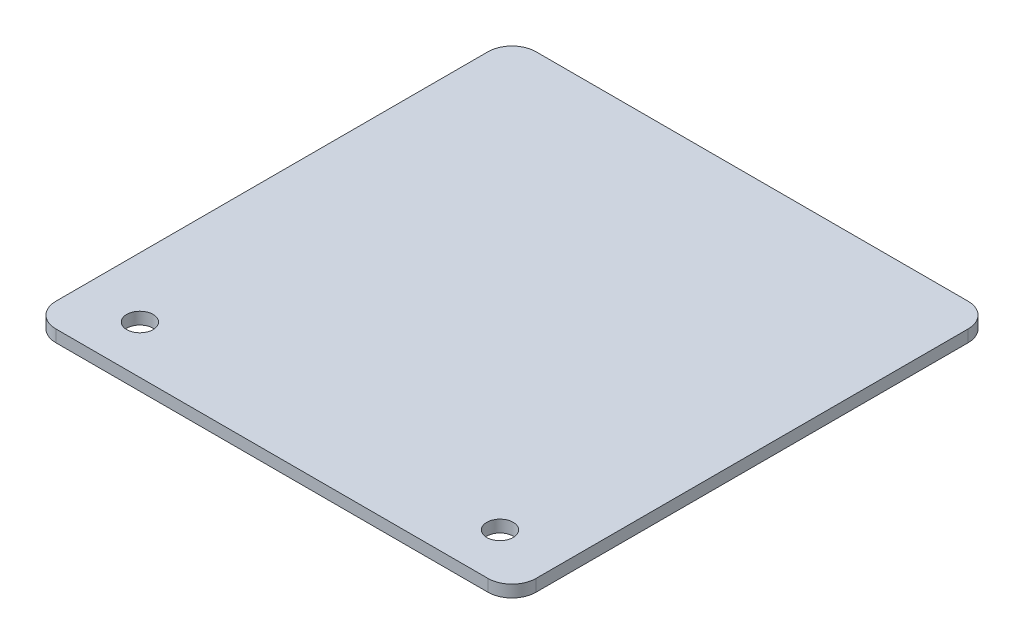
ISO-10303-21;
HEADER;
FILE_DESCRIPTION(('STEP AP214'),'2;1');
FILE_NAME('part.step','',(''),(''),'','','');
FILE_SCHEMA(('AUTOMOTIVE_DESIGN { 1 0 10303 214 1 1 1 1 }'));
ENDSEC;
DATA;
#1=APPLICATION_CONTEXT('core data for automotive mechanical design processes');
#2=APPLICATION_PROTOCOL_DEFINITION('international standard','automotive_design',2000,#1);
#3=PRODUCT_CONTEXT('',#1,'mechanical');
#4=PRODUCT('Part','Part','',(#3));
#5=PRODUCT_RELATED_PRODUCT_CATEGORY('part','',(#4));
#6=PRODUCT_DEFINITION_FORMATION('','',#4);
#7=PRODUCT_DEFINITION_CONTEXT('part definition',#1,'design');
#8=PRODUCT_DEFINITION('design','',#6,#7);
#9=PRODUCT_DEFINITION_SHAPE('','',#8);
#10=(LENGTH_UNIT() NAMED_UNIT(*) SI_UNIT(.MILLI.,.METRE.));
#11=(NAMED_UNIT(*) PLANE_ANGLE_UNIT() SI_UNIT($,.RADIAN.));
#12=(NAMED_UNIT(*) SI_UNIT($,.STERADIAN.) SOLID_ANGLE_UNIT());
#13=UNCERTAINTY_MEASURE_WITH_UNIT(LENGTH_MEASURE(1.E-05),#10,'distance_accuracy_value','');
#14=(GEOMETRIC_REPRESENTATION_CONTEXT(3) GLOBAL_UNCERTAINTY_ASSIGNED_CONTEXT((#13)) GLOBAL_UNIT_ASSIGNED_CONTEXT((#10,
#11,#12)) REPRESENTATION_CONTEXT('',''));
#15=CARTESIAN_POINT('',(0.,0.,0.));
#16=DIRECTION('',(0.,0.,1.));
#17=DIRECTION('',(1.,0.,0.));
#18=AXIS2_PLACEMENT_3D('',#15,#16,#17);
#19=CARTESIAN_POINT('',(50.,2.5,50.));
#20=DIRECTION('',(-1.,0.,0.));
#21=DIRECTION('',(0.,0.,1.));
#22=AXIS2_PLACEMENT_3D('',#19,#20,#21);
#23=PLANE('',#22);
#24=DIRECTION('',(0.,0.,-1.));
#25=VECTOR('',#24,1.);
#26=CARTESIAN_POINT('',(50.,0.,50.));
#27=LINE('',#26,#25);
#28=CARTESIAN_POINT('',(50.,0.,45.));
#29=VERTEX_POINT('',#28);
#30=CARTESIAN_POINT('',(50.,0.,-45.));
#31=VERTEX_POINT('',#30);
#32=EDGE_CURVE('E129',#29,#31,#27,.T.);
#33=ORIENTED_EDGE('',*,*,#32,.T.);
#34=DIRECTION('',(0.,-1.,0.));
#35=VECTOR('',#34,1.);
#36=CARTESIAN_POINT('',(50.,2.5,-45.));
#37=LINE('',#36,#35);
#38=CARTESIAN_POINT('',(50.,2.5,-45.));
#39=VERTEX_POINT('',#38);
#40=EDGE_CURVE('E159',#31,#39,#37,.F.);
#41=ORIENTED_EDGE('',*,*,#40,.T.);
#42=DIRECTION('',(0.,0.,-1.));
#43=VECTOR('',#42,1.);
#44=CARTESIAN_POINT('',(50.,2.5,50.));
#45=LINE('',#44,#43);
#46=CARTESIAN_POINT('',(50.,2.5,45.));
#47=VERTEX_POINT('',#46);
#48=EDGE_CURVE('E127',#47,#39,#45,.T.);
#49=ORIENTED_EDGE('',*,*,#48,.F.);
#50=DIRECTION('',(0.,-1.,0.));
#51=VECTOR('',#50,1.);
#52=CARTESIAN_POINT('',(50.,2.5,45.));
#53=LINE('',#52,#51);
#54=EDGE_CURVE('E156',#47,#29,#53,.T.);
#55=ORIENTED_EDGE('',*,*,#54,.T.);
#56=EDGE_LOOP('',(#33,#41,#49,#55));
#57=FACE_BOUND('',#56,.T.);
#58=ADVANCED_FACE('F32',(#57),#23,.F.);
#59=CARTESIAN_POINT('',(-50.,2.5,-50.));
#60=DIRECTION('',(0.,0.,1.));
#61=DIRECTION('',(1.,0.,0.));
#62=AXIS2_PLACEMENT_3D('',#59,#60,#61);
#63=PLANE('',#62);
#64=DIRECTION('',(-1.,0.,0.));
#65=VECTOR('',#64,1.);
#66=CARTESIAN_POINT('',(-50.,0.,-50.));
#67=LINE('',#66,#65);
#68=CARTESIAN_POINT('',(45.,0.,-50.));
#69=VERTEX_POINT('',#68);
#70=CARTESIAN_POINT('',(-45.,0.,-50.));
#71=VERTEX_POINT('',#70);
#72=EDGE_CURVE('E125',#69,#71,#67,.T.);
#73=ORIENTED_EDGE('',*,*,#72,.T.);
#74=DIRECTION('',(0.,-1.,0.));
#75=VECTOR('',#74,1.);
#76=CARTESIAN_POINT('',(-45.,2.5,-50.));
#77=LINE('',#76,#75);
#78=CARTESIAN_POINT('',(-45.,2.5,-50.));
#79=VERTEX_POINT('',#78);
#80=EDGE_CURVE('E103',#71,#79,#77,.F.);
#81=ORIENTED_EDGE('',*,*,#80,.T.);
#82=DIRECTION('',(-1.,0.,0.));
#83=VECTOR('',#82,1.);
#84=CARTESIAN_POINT('',(-50.,2.5,-50.));
#85=LINE('',#84,#83);
#86=CARTESIAN_POINT('',(45.,2.5,-50.));
#87=VERTEX_POINT('',#86);
#88=EDGE_CURVE('E173',#87,#79,#85,.T.);
#89=ORIENTED_EDGE('',*,*,#88,.F.);
#90=DIRECTION('',(0.,-1.,0.));
#91=VECTOR('',#90,1.);
#92=CARTESIAN_POINT('',(45.,2.5,-50.));
#93=LINE('',#92,#91);
#94=EDGE_CURVE('E108',#87,#69,#93,.T.);
#95=ORIENTED_EDGE('',*,*,#94,.T.);
#96=EDGE_LOOP('',(#73,#81,#89,#95));
#97=FACE_BOUND('',#96,.T.);
#98=ADVANCED_FACE('F178',(#97),#63,.F.);
#99=CARTESIAN_POINT('',(-50.,2.5,50.));
#100=DIRECTION('',(1.,0.,0.));
#101=DIRECTION('',(0.,0.,-1.));
#102=AXIS2_PLACEMENT_3D('',#99,#100,#101);
#103=PLANE('',#102);
#104=DIRECTION('',(0.,0.,1.));
#105=VECTOR('',#104,1.);
#106=CARTESIAN_POINT('',(-50.,2.5,50.));
#107=LINE('',#106,#105);
#108=CARTESIAN_POINT('',(-50.,2.5,-45.));
#109=VERTEX_POINT('',#108);
#110=CARTESIAN_POINT('',(-50.,2.5,45.));
#111=VERTEX_POINT('',#110);
#112=EDGE_CURVE('E117',#109,#111,#107,.T.);
#113=ORIENTED_EDGE('',*,*,#112,.F.);
#114=DIRECTION('',(0.,-1.,0.));
#115=VECTOR('',#114,1.);
#116=CARTESIAN_POINT('',(-50.,2.5,-45.));
#117=LINE('',#116,#115);
#118=CARTESIAN_POINT('',(-50.,0.,-45.));
#119=VERTEX_POINT('',#118);
#120=EDGE_CURVE('E102',#109,#119,#117,.T.);
#121=ORIENTED_EDGE('',*,*,#120,.T.);
#122=DIRECTION('',(0.,0.,1.));
#123=VECTOR('',#122,1.);
#124=CARTESIAN_POINT('',(-50.,0.,50.));
#125=LINE('',#124,#123);
#126=CARTESIAN_POINT('',(-50.,0.,45.));
#127=VERTEX_POINT('',#126);
#128=EDGE_CURVE('E115',#119,#127,#125,.T.);
#129=ORIENTED_EDGE('',*,*,#128,.T.);
#130=DIRECTION('',(0.,-1.,0.));
#131=VECTOR('',#130,1.);
#132=CARTESIAN_POINT('',(-50.,2.5,45.));
#133=LINE('',#132,#131);
#134=EDGE_CURVE('E119',#127,#111,#133,.F.);
#135=ORIENTED_EDGE('',*,*,#134,.T.);
#136=EDGE_LOOP('',(#113,#121,#129,#135));
#137=FACE_BOUND('',#136,.T.);
#138=ADVANCED_FACE('F114',(#137),#103,.F.);
#139=CARTESIAN_POINT('',(-50.,2.5,50.));
#140=DIRECTION('',(0.,0.,-1.));
#141=DIRECTION('',(-1.,0.,0.));
#142=AXIS2_PLACEMENT_3D('',#139,#140,#141);
#143=PLANE('',#142);
#144=DIRECTION('',(1.,0.,0.));
#145=VECTOR('',#144,1.);
#146=CARTESIAN_POINT('',(-50.,2.5,50.));
#147=LINE('',#146,#145);
#148=CARTESIAN_POINT('',(-45.,2.5,50.));
#149=VERTEX_POINT('',#148);
#150=CARTESIAN_POINT('',(45.,2.5,50.));
#151=VERTEX_POINT('',#150);
#152=EDGE_CURVE('E141',#149,#151,#147,.T.);
#153=ORIENTED_EDGE('',*,*,#152,.F.);
#154=DIRECTION('',(0.,-1.,0.));
#155=VECTOR('',#154,1.);
#156=CARTESIAN_POINT('',(-45.,2.5,50.));
#157=LINE('',#156,#155);
#158=CARTESIAN_POINT('',(-45.,0.,50.));
#159=VERTEX_POINT('',#158);
#160=EDGE_CURVE('E11',#149,#159,#157,.T.);
#161=ORIENTED_EDGE('',*,*,#160,.T.);
#162=DIRECTION('',(1.,0.,0.));
#163=VECTOR('',#162,1.);
#164=CARTESIAN_POINT('',(-50.,0.,50.));
#165=LINE('',#164,#163);
#166=CARTESIAN_POINT('',(45.,0.,50.));
#167=VERTEX_POINT('',#166);
#168=EDGE_CURVE('E124',#159,#167,#165,.T.);
#169=ORIENTED_EDGE('',*,*,#168,.T.);
#170=DIRECTION('',(0.,-1.,0.));
#171=VECTOR('',#170,1.);
#172=CARTESIAN_POINT('',(45.,2.5,50.));
#173=LINE('',#172,#171);
#174=EDGE_CURVE('E40',#167,#151,#173,.F.);
#175=ORIENTED_EDGE('',*,*,#174,.T.);
#176=EDGE_LOOP('',(#153,#161,#169,#175));
#177=FACE_BOUND('',#176,.T.);
#178=ADVANCED_FACE('F192',(#177),#143,.F.);
#179=CARTESIAN_POINT('',(0.,2.5,0.));
#180=DIRECTION('',(0.,-1.,0.));
#181=DIRECTION('',(0.,0.,-1.));
#182=AXIS2_PLACEMENT_3D('',#179,#180,#181);
#183=PLANE('',#182);
#184=CARTESIAN_POINT('',(-37.5,2.5,40.));
#185=DIRECTION('',(0.,1.,0.));
#186=DIRECTION('',(0.,0.,1.));
#187=AXIS2_PLACEMENT_3D('',#184,#185,#186);
#188=CIRCLE('',#187,2.74999999999999);
#189=CARTESIAN_POINT('',(-37.5,2.5,42.75));
#190=VERTEX_POINT('',#189);
#191=EDGE_CURVE('E140',#190,#190,#188,.T.);
#192=ORIENTED_EDGE('',*,*,#191,.F.);
#193=EDGE_LOOP('',(#192));
#194=FACE_BOUND('',#193,.T.);
#195=CARTESIAN_POINT('',(37.5,2.5,40.));
#196=DIRECTION('',(0.,1.,0.));
#197=DIRECTION('',(0.,0.,1.));
#198=AXIS2_PLACEMENT_3D('',#195,#196,#197);
#199=CIRCLE('',#198,2.74999999999999);
#200=CARTESIAN_POINT('',(37.5,2.5,42.75));
#201=VERTEX_POINT('',#200);
#202=EDGE_CURVE('E136',#201,#201,#199,.T.);
#203=ORIENTED_EDGE('',*,*,#202,.F.);
#204=EDGE_LOOP('',(#203));
#205=FACE_BOUND('',#204,.T.);
#206=ORIENTED_EDGE('',*,*,#88,.T.);
#207=CARTESIAN_POINT('',(-45.,2.5,-45.));
#208=DIRECTION('',(0.,-1.,0.));
#209=DIRECTION('',(0.,0.,-1.));
#210=AXIS2_PLACEMENT_3D('',#207,#208,#209);
#211=CIRCLE('',#210,5.);
#212=EDGE_CURVE('E154',#79,#109,#211,.F.);
#213=ORIENTED_EDGE('',*,*,#212,.T.);
#214=ORIENTED_EDGE('',*,*,#112,.T.);
#215=CARTESIAN_POINT('',(-45.,2.5,45.));
#216=DIRECTION('',(0.,-1.,0.));
#217=DIRECTION('',(0.,0.,-1.));
#218=AXIS2_PLACEMENT_3D('',#215,#216,#217);
#219=CIRCLE('',#218,5.);
#220=EDGE_CURVE('E53',#111,#149,#219,.F.);
#221=ORIENTED_EDGE('',*,*,#220,.T.);
#222=ORIENTED_EDGE('',*,*,#152,.T.);
#223=CARTESIAN_POINT('',(45.,2.5,45.));
#224=DIRECTION('',(0.,-1.,0.));
#225=DIRECTION('',(0.,0.,-1.));
#226=AXIS2_PLACEMENT_3D('',#223,#224,#225);
#227=CIRCLE('',#226,5.);
#228=EDGE_CURVE('E149',#151,#47,#227,.F.);
#229=ORIENTED_EDGE('',*,*,#228,.T.);
#230=ORIENTED_EDGE('',*,*,#48,.T.);
#231=CARTESIAN_POINT('',(45.,2.5,-45.));
#232=DIRECTION('',(0.,-1.,0.));
#233=DIRECTION('',(0.,0.,-1.));
#234=AXIS2_PLACEMENT_3D('',#231,#232,#233);
#235=CIRCLE('',#234,5.);
#236=EDGE_CURVE('E152',#39,#87,#235,.F.);
#237=ORIENTED_EDGE('',*,*,#236,.T.);
#238=EDGE_LOOP('',(#206,#213,#214,#221,#222,#229,#230,#237));
#239=FACE_BOUND('',#238,.T.);
#240=ADVANCED_FACE('F170',(#194,#205,#239),#183,.F.);
#241=CARTESIAN_POINT('',(0.,0.,0.));
#242=DIRECTION('',(0.,-1.,0.));
#243=DIRECTION('',(0.,0.,-1.));
#244=AXIS2_PLACEMENT_3D('',#241,#242,#243);
#245=PLANE('',#244);
#246=CARTESIAN_POINT('',(-37.5,0.,40.));
#247=DIRECTION('',(0.,-1.,0.));
#248=DIRECTION('',(0.,0.,-1.));
#249=AXIS2_PLACEMENT_3D('',#246,#247,#248);
#250=CIRCLE('',#249,2.74999999999999);
#251=CARTESIAN_POINT('',(-37.5,0.,37.25));
#252=VERTEX_POINT('',#251);
#253=EDGE_CURVE('E137',#252,#252,#250,.T.);
#254=ORIENTED_EDGE('',*,*,#253,.F.);
#255=EDGE_LOOP('',(#254));
#256=FACE_BOUND('',#255,.T.);
#257=CARTESIAN_POINT('',(37.5,0.,40.));
#258=DIRECTION('',(0.,-1.,0.));
#259=DIRECTION('',(0.,0.,-1.));
#260=AXIS2_PLACEMENT_3D('',#257,#258,#259);
#261=CIRCLE('',#260,2.74999999999999);
#262=CARTESIAN_POINT('',(37.5,0.,37.25));
#263=VERTEX_POINT('',#262);
#264=EDGE_CURVE('E133',#263,#263,#261,.T.);
#265=ORIENTED_EDGE('',*,*,#264,.F.);
#266=EDGE_LOOP('',(#265));
#267=FACE_BOUND('',#266,.T.);
#268=ORIENTED_EDGE('',*,*,#128,.F.);
#269=CARTESIAN_POINT('',(-45.,0.,-45.));
#270=DIRECTION('',(0.,-1.,0.));
#271=DIRECTION('',(0.,0.,-1.));
#272=AXIS2_PLACEMENT_3D('',#269,#270,#271);
#273=CIRCLE('',#272,5.);
#274=EDGE_CURVE('E98',#119,#71,#273,.T.);
#275=ORIENTED_EDGE('',*,*,#274,.T.);
#276=ORIENTED_EDGE('',*,*,#72,.F.);
#277=CARTESIAN_POINT('',(45.,0.,-45.));
#278=DIRECTION('',(0.,-1.,0.));
#279=DIRECTION('',(0.,0.,-1.));
#280=AXIS2_PLACEMENT_3D('',#277,#278,#279);
#281=CIRCLE('',#280,5.);
#282=EDGE_CURVE('E109',#69,#31,#281,.T.);
#283=ORIENTED_EDGE('',*,*,#282,.T.);
#284=ORIENTED_EDGE('',*,*,#32,.F.);
#285=CARTESIAN_POINT('',(45.,0.,45.));
#286=DIRECTION('',(0.,-1.,0.));
#287=DIRECTION('',(0.,0.,-1.));
#288=AXIS2_PLACEMENT_3D('',#285,#286,#287);
#289=CIRCLE('',#288,5.);
#290=EDGE_CURVE('E118',#29,#167,#289,.T.);
#291=ORIENTED_EDGE('',*,*,#290,.T.);
#292=ORIENTED_EDGE('',*,*,#168,.F.);
#293=CARTESIAN_POINT('',(-45.,0.,45.));
#294=DIRECTION('',(0.,-1.,0.));
#295=DIRECTION('',(0.,0.,-1.));
#296=AXIS2_PLACEMENT_3D('',#293,#294,#295);
#297=CIRCLE('',#296,5.);
#298=EDGE_CURVE('E123',#159,#127,#297,.T.);
#299=ORIENTED_EDGE('',*,*,#298,.T.);
#300=EDGE_LOOP('',(#268,#275,#276,#283,#284,#291,#292,#299));
#301=FACE_BOUND('',#300,.T.);
#302=ADVANCED_FACE('F121',(#256,#267,#301),#245,.T.);
#303=CARTESIAN_POINT('',(37.5,2.5,40.));
#304=DIRECTION('',(0.,1.,0.));
#305=DIRECTION('',(0.,0.,1.));
#306=AXIS2_PLACEMENT_3D('',#303,#304,#305);
#307=CYLINDRICAL_SURFACE('',#306,2.74999999999999);
#308=ORIENTED_EDGE('',*,*,#264,.T.);
#309=EDGE_LOOP('',(#308));
#310=FACE_BOUND('',#309,.T.);
#311=ORIENTED_EDGE('',*,*,#202,.T.);
#312=EDGE_LOOP('',(#311));
#313=FACE_BOUND('',#312,.T.);
#314=ADVANCED_FACE('F196',(#310,#313),#307,.F.);
#315=CARTESIAN_POINT('',(-37.5,2.5,40.));
#316=DIRECTION('',(0.,1.,0.));
#317=DIRECTION('',(0.,0.,1.));
#318=AXIS2_PLACEMENT_3D('',#315,#316,#317);
#319=CYLINDRICAL_SURFACE('',#318,2.74999999999999);
#320=ORIENTED_EDGE('',*,*,#253,.T.);
#321=EDGE_LOOP('',(#320));
#322=FACE_BOUND('',#321,.T.);
#323=ORIENTED_EDGE('',*,*,#191,.T.);
#324=EDGE_LOOP('',(#323));
#325=FACE_BOUND('',#324,.T.);
#326=ADVANCED_FACE('F188',(#322,#325),#319,.F.);
#327=CARTESIAN_POINT('',(-45.,2.5,-45.));
#328=DIRECTION('',(0.,-1.,0.));
#329=DIRECTION('',(0.,0.,-1.));
#330=AXIS2_PLACEMENT_3D('',#327,#328,#329);
#331=CYLINDRICAL_SURFACE('',#330,5.);
#332=ORIENTED_EDGE('',*,*,#212,.F.);
#333=ORIENTED_EDGE('',*,*,#80,.F.);
#334=ORIENTED_EDGE('',*,*,#274,.F.);
#335=ORIENTED_EDGE('',*,*,#120,.F.);
#336=EDGE_LOOP('',(#332,#333,#334,#335));
#337=FACE_BOUND('',#336,.T.);
#338=ADVANCED_FACE('F101',(#337),#331,.T.);
#339=CARTESIAN_POINT('',(45.,2.5,-45.));
#340=DIRECTION('',(0.,-1.,0.));
#341=DIRECTION('',(0.,0.,-1.));
#342=AXIS2_PLACEMENT_3D('',#339,#340,#341);
#343=CYLINDRICAL_SURFACE('',#342,5.);
#344=ORIENTED_EDGE('',*,*,#236,.F.);
#345=ORIENTED_EDGE('',*,*,#40,.F.);
#346=ORIENTED_EDGE('',*,*,#282,.F.);
#347=ORIENTED_EDGE('',*,*,#94,.F.);
#348=EDGE_LOOP('',(#344,#345,#346,#347));
#349=FACE_BOUND('',#348,.T.);
#350=ADVANCED_FACE('F176',(#349),#343,.T.);
#351=CARTESIAN_POINT('',(-45.,2.5,45.));
#352=DIRECTION('',(0.,-1.,0.));
#353=DIRECTION('',(0.,0.,-1.));
#354=AXIS2_PLACEMENT_3D('',#351,#352,#353);
#355=CYLINDRICAL_SURFACE('',#354,5.);
#356=ORIENTED_EDGE('',*,*,#220,.F.);
#357=ORIENTED_EDGE('',*,*,#134,.F.);
#358=ORIENTED_EDGE('',*,*,#298,.F.);
#359=ORIENTED_EDGE('',*,*,#160,.F.);
#360=EDGE_LOOP('',(#356,#357,#358,#359));
#361=FACE_BOUND('',#360,.T.);
#362=ADVANCED_FACE('F219',(#361),#355,.T.);
#363=CARTESIAN_POINT('',(45.,2.5,45.));
#364=DIRECTION('',(0.,-1.,0.));
#365=DIRECTION('',(0.,0.,-1.));
#366=AXIS2_PLACEMENT_3D('',#363,#364,#365);
#367=CYLINDRICAL_SURFACE('',#366,5.);
#368=ORIENTED_EDGE('',*,*,#228,.F.);
#369=ORIENTED_EDGE('',*,*,#174,.F.);
#370=ORIENTED_EDGE('',*,*,#290,.F.);
#371=ORIENTED_EDGE('',*,*,#54,.F.);
#372=EDGE_LOOP('',(#368,#369,#370,#371));
#373=FACE_BOUND('',#372,.T.);
#374=ADVANCED_FACE('F34',(#373),#367,.T.);
#375=CLOSED_SHELL('',(#58,#98,#138,#178,#240,#302,#314,#326,#338,#350,#362,#374));
#376=MANIFOLD_SOLID_BREP('B2',#375);
#377=ADVANCED_BREP_SHAPE_REPRESENTATION('',(#18,#376),#14);
#378=SHAPE_DEFINITION_REPRESENTATION(#9,#377);
ENDSEC;
END-ISO-10303-21;
